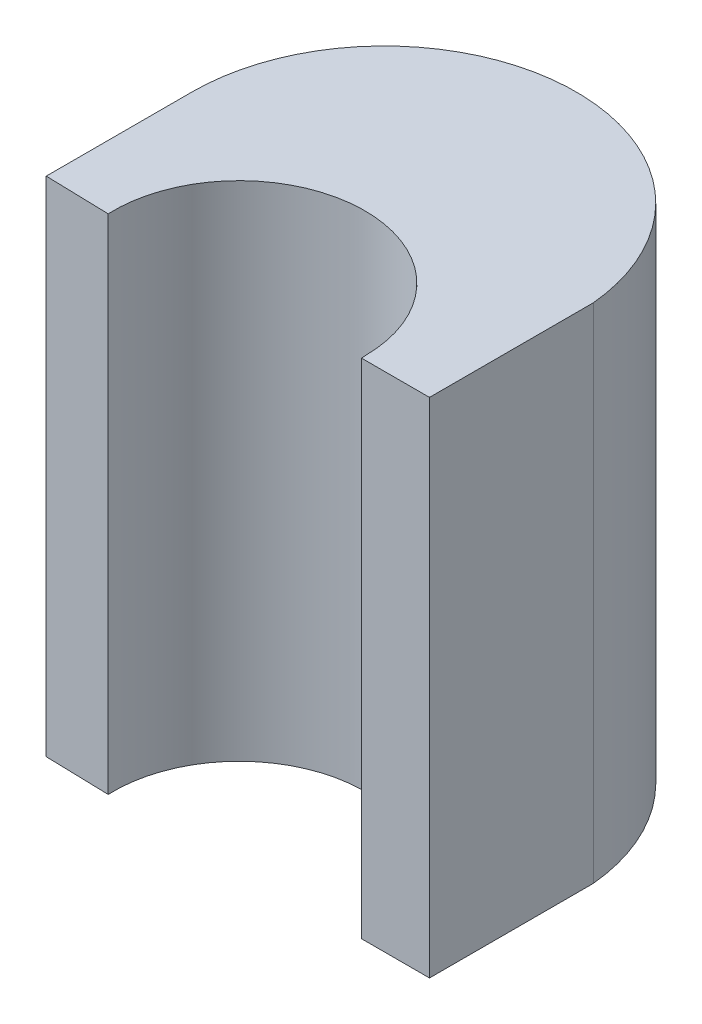
ISO-10303-21;
HEADER;
FILE_DESCRIPTION(('STEP AP214'),'2;1');
FILE_NAME('part.step','',(''),(''),'','','');
FILE_SCHEMA(('AUTOMOTIVE_DESIGN { 1 0 10303 214 1 1 1 1 }'));
ENDSEC;
DATA;
#1=APPLICATION_CONTEXT('core data for automotive mechanical design processes');
#2=APPLICATION_PROTOCOL_DEFINITION('international standard','automotive_design',2000,#1);
#3=PRODUCT_CONTEXT('',#1,'mechanical');
#4=PRODUCT('Part','Part','',(#3));
#5=PRODUCT_RELATED_PRODUCT_CATEGORY('part','',(#4));
#6=PRODUCT_DEFINITION_FORMATION('','',#4);
#7=PRODUCT_DEFINITION_CONTEXT('part definition',#1,'design');
#8=PRODUCT_DEFINITION('design','',#6,#7);
#9=PRODUCT_DEFINITION_SHAPE('','',#8);
#10=(LENGTH_UNIT() NAMED_UNIT(*) SI_UNIT(.MILLI.,.METRE.));
#11=(NAMED_UNIT(*) PLANE_ANGLE_UNIT() SI_UNIT($,.RADIAN.));
#12=(NAMED_UNIT(*) SI_UNIT($,.STERADIAN.) SOLID_ANGLE_UNIT());
#13=UNCERTAINTY_MEASURE_WITH_UNIT(LENGTH_MEASURE(1.E-05),#10,'distance_accuracy_value','');
#14=(GEOMETRIC_REPRESENTATION_CONTEXT(3) GLOBAL_UNCERTAINTY_ASSIGNED_CONTEXT((#13)) GLOBAL_UNIT_ASSIGNED_CONTEXT((#10,
#11,#12)) REPRESENTATION_CONTEXT('',''));
#15=CARTESIAN_POINT('',(0.,0.,0.));
#16=DIRECTION('',(0.,0.,1.));
#17=DIRECTION('',(1.,0.,0.));
#18=AXIS2_PLACEMENT_3D('',#15,#16,#17);
#19=CARTESIAN_POINT('',(1.26536763995208,2.87183105039429,15.5890947887312));
#20=DIRECTION('',(0.,1.,0.));
#21=DIRECTION('',(0.,0.,-1.));
#22=AXIS2_PLACEMENT_3D('',#19,#20,#21);
#23=PLANE('',#22);
#24=CARTESIAN_POINT('',(-2.63265771786195,2.87183105039429,24.489760866987));
#25=DIRECTION('',(0.,1.,0.));
#26=DIRECTION('',(0.,0.,-1.));
#27=AXIS2_PLACEMENT_3D('',#24,#25,#26);
#28=CIRCLE('',#27,0.299999999999994);
#29=CARTESIAN_POINT('',(-2.33292665507399,2.87183105039429,24.4770608669871));
#30=VERTEX_POINT('',#29);
#31=CARTESIAN_POINT('',(-2.33353671329765,2.87183105039429,24.4668125635979));
#32=VERTEX_POINT('',#31);
#33=EDGE_CURVE('E73',#30,#32,#28,.T.);
#34=ORIENTED_EDGE('',*,*,#33,.F.);
#35=DIRECTION('',(1.,0.,2.19014998791785E-13));
#36=VECTOR('',#35,1.);
#37=CARTESIAN_POINT('',(-2.33292665507398,2.87183105039429,24.4770608669871));
#38=LINE('',#37,#36);
#39=CARTESIAN_POINT('',(-2.17054877174569,2.87183105039429,24.4770608669871));
#40=VERTEX_POINT('',#39);
#41=EDGE_CURVE('E101',#30,#40,#38,.T.);
#42=ORIENTED_EDGE('',*,*,#41,.T.);
#43=DIRECTION('',(-2.31603663807447E-12,0.,1.));
#44=VECTOR('',#43,1.);
#45=CARTESIAN_POINT('',(-2.17054877174478,2.87183105039429,24.0858628882505));
#46=LINE('',#45,#44);
#47=CARTESIAN_POINT('',(-2.17054877174478,2.87183105039429,24.0858628882505));
#48=VERTEX_POINT('',#47);
#49=EDGE_CURVE('E27',#48,#40,#46,.T.);
#50=ORIENTED_EDGE('',*,*,#49,.F.);
#51=CARTESIAN_POINT('',(-2.62684216672861,2.87183105039429,24.1289507885883));
#52=DIRECTION('',(0.,1.,0.));
#53=DIRECTION('',(0.995571061700838,0.,-0.0940120263788917));
#54=AXIS2_PLACEMENT_3D('',#51,#52,#53);
#55=CIRCLE('',#54,0.458323280514298);
#56=CARTESIAN_POINT('',(-3.0851654472429,2.87183105039429,24.1289507885881));
#57=VERTEX_POINT('',#56);
#58=EDGE_CURVE('E11',#48,#57,#55,.T.);
#59=ORIENTED_EDGE('',*,*,#58,.T.);
#60=DIRECTION('',(-7.39892430869169E-12,0.,-1.));
#61=VECTOR('',#60,1.);
#62=CARTESIAN_POINT('',(-3.08516544724032,2.87183105039429,24.4770608669869));
#63=LINE('',#62,#61);
#64=CARTESIAN_POINT('',(-3.08516544724032,2.87183105039429,24.4770608669869));
#65=VERTEX_POINT('',#64);
#66=EDGE_CURVE('E132',#65,#57,#63,.T.);
#67=ORIENTED_EDGE('',*,*,#66,.F.);
#68=DIRECTION('',(0.999641624888658,0.,0.0267697924901118));
#69=VECTOR('',#68,1.);
#70=CARTESIAN_POINT('',(-3.08516544724032,2.87183105039429,24.4770608669869));
#71=LINE('',#70,#69);
#72=CARTESIAN_POINT('',(-2.93326342274814,2.87183105039429,24.4811287104753));
#73=VERTEX_POINT('',#72);
#74=EDGE_CURVE('E131',#65,#73,#71,.T.);
#75=ORIENTED_EDGE('',*,*,#74,.T.);
#76=CARTESIAN_POINT('',(-2.63353236004813,2.87183105039429,24.4684287104753));
#77=DIRECTION('',(0.,1.,0.));
#78=DIRECTION('',(0.999103542626609,0.,0.0423333333315546));
#79=AXIS2_PLACEMENT_3D('',#76,#77,#78);
#80=CIRCLE('',#79,0.299999999999991);
#81=EDGE_CURVE('E61',#32,#73,#80,.T.);
#82=ORIENTED_EDGE('',*,*,#81,.F.);
#83=EDGE_LOOP('',(#34,#42,#50,#59,#67,#75,#82));
#84=FACE_BOUND('',#83,.T.);
#85=ADVANCED_FACE('F17',(#84),#23,.T.);
#86=CARTESIAN_POINT('',(-2.62684216672861,2.87183105039429,24.1289507885883));
#87=DIRECTION('',(0.,-1.,0.));
#88=DIRECTION('',(0.995571061700838,0.,-0.0940120263788917));
#89=AXIS2_PLACEMENT_3D('',#86,#87,#88);
#90=CYLINDRICAL_SURFACE('',#89,0.458323280514298);
#91=CARTESIAN_POINT('',(-2.62684216672861,1.6718310055699,24.1289507885883));
#92=DIRECTION('',(0.,1.,0.));
#93=DIRECTION('',(0.995571061700838,0.,-0.0940120263788917));
#94=AXIS2_PLACEMENT_3D('',#91,#92,#93);
#95=CIRCLE('',#94,0.458323280514298);
#96=CARTESIAN_POINT('',(-2.17054877174478,1.6718310055699,24.0858628882505));
#97=VERTEX_POINT('',#96);
#98=CARTESIAN_POINT('',(-3.08516544724289,1.6718310055699,24.1289507885881));
#99=VERTEX_POINT('',#98);
#100=EDGE_CURVE('E117',#97,#99,#95,.T.);
#101=ORIENTED_EDGE('',*,*,#100,.T.);
#102=DIRECTION('',(0.,-1.,0.));
#103=VECTOR('',#102,1.);
#104=CARTESIAN_POINT('',(-3.0851654472429,2.87183105039429,24.1289507885881));
#105=LINE('',#104,#103);
#106=EDGE_CURVE('E136',#57,#99,#105,.T.);
#107=ORIENTED_EDGE('',*,*,#106,.F.);
#108=ORIENTED_EDGE('',*,*,#58,.F.);
#109=DIRECTION('',(0.,-1.,0.));
#110=VECTOR('',#109,1.);
#111=CARTESIAN_POINT('',(-2.17054877174478,2.87183105039429,24.0858628882505));
#112=LINE('',#111,#110);
#113=EDGE_CURVE('E87',#48,#97,#112,.T.);
#114=ORIENTED_EDGE('',*,*,#113,.T.);
#115=EDGE_LOOP('',(#101,#107,#108,#114));
#116=FACE_BOUND('',#115,.T.);
#117=ADVANCED_FACE('F255',(#116),#90,.T.);
#118=CARTESIAN_POINT('',(-2.17054877174478,2.87183105039429,24.0858628882505));
#119=DIRECTION('',(1.,0.,2.31603663807447E-12));
#120=DIRECTION('',(-2.31603663807447E-12,0.,1.));
#121=AXIS2_PLACEMENT_3D('',#118,#119,#120);
#122=PLANE('',#121);
#123=DIRECTION('',(2.31603663807447E-12,0.,-1.));
#124=VECTOR('',#123,1.);
#125=CARTESIAN_POINT('',(-2.17054877173494,1.6718310055699,19.8374788384868));
#126=LINE('',#125,#124);
#127=CARTESIAN_POINT('',(-2.17054877174568,1.6718310055699,24.4770608669871));
#128=VERTEX_POINT('',#127);
#129=EDGE_CURVE('E96',#128,#97,#126,.T.);
#130=ORIENTED_EDGE('',*,*,#129,.T.);
#131=ORIENTED_EDGE('',*,*,#113,.F.);
#132=ORIENTED_EDGE('',*,*,#49,.T.);
#133=DIRECTION('',(0.,-1.,0.));
#134=VECTOR('',#133,1.);
#135=CARTESIAN_POINT('',(-2.17054877174569,2.87183105039429,24.4770608669871));
#136=LINE('',#135,#134);
#137=EDGE_CURVE('E93',#40,#128,#136,.T.);
#138=ORIENTED_EDGE('',*,*,#137,.T.);
#139=EDGE_LOOP('',(#130,#131,#132,#138));
#140=FACE_BOUND('',#139,.T.);
#141=ADVANCED_FACE('F19',(#140),#122,.T.);
#142=CARTESIAN_POINT('',(-2.17054877174569,2.87183105039429,24.4770608669871));
#143=DIRECTION('',(-2.19014998791785E-13,0.,1.));
#144=DIRECTION('',(1.,0.,2.19014998791785E-13));
#145=AXIS2_PLACEMENT_3D('',#142,#143,#144);
#146=PLANE('',#145);
#147=DIRECTION('',(1.,0.,2.19014998791785E-13));
#148=VECTOR('',#147,1.);
#149=CARTESIAN_POINT('',(-0.452590565897774,1.6718310055699,24.4770608669875));
#150=LINE('',#149,#148);
#151=CARTESIAN_POINT('',(-2.33292665507399,1.6718310055699,24.4770608669871));
#152=VERTEX_POINT('',#151);
#153=EDGE_CURVE('E105',#152,#128,#150,.T.);
#154=ORIENTED_EDGE('',*,*,#153,.T.);
#155=ORIENTED_EDGE('',*,*,#137,.F.);
#156=ORIENTED_EDGE('',*,*,#41,.F.);
#157=DIRECTION('',(0.,-1.,0.));
#158=VECTOR('',#157,1.);
#159=CARTESIAN_POINT('',(-2.33292665507399,2.87183105039429,24.4770608669871));
#160=LINE('',#159,#158);
#161=EDGE_CURVE('E108',#30,#152,#160,.T.);
#162=ORIENTED_EDGE('',*,*,#161,.T.);
#163=EDGE_LOOP('',(#154,#155,#156,#162));
#164=FACE_BOUND('',#163,.T.);
#165=ADVANCED_FACE('F106',(#164),#146,.T.);
#166=CARTESIAN_POINT('',(-2.63265771786195,2.87183105039429,24.489760866987));
#167=DIRECTION('',(0.,-1.,0.));
#168=DIRECTION('',(0.,0.,-1.));
#169=AXIS2_PLACEMENT_3D('',#166,#167,#168);
#170=CYLINDRICAL_SURFACE('',#169,0.299999999999994);
#171=CARTESIAN_POINT('',(-2.63265771786195,1.6718310055699,24.489760866987));
#172=DIRECTION('',(0.,-1.,0.));
#173=DIRECTION('',(0.,0.,-1.));
#174=AXIS2_PLACEMENT_3D('',#171,#172,#173);
#175=CIRCLE('',#174,0.299999999999994);
#176=CARTESIAN_POINT('',(-2.33353671329764,1.6718310055699,24.4668125635979));
#177=VERTEX_POINT('',#176);
#178=EDGE_CURVE('E227',#177,#152,#175,.T.);
#179=ORIENTED_EDGE('',*,*,#178,.T.);
#180=ORIENTED_EDGE('',*,*,#161,.F.);
#181=ORIENTED_EDGE('',*,*,#33,.T.);
#182=DIRECTION('',(0.,-1.,0.));
#183=VECTOR('',#182,1.);
#184=CARTESIAN_POINT('',(-2.33353671329765,2.87183105039429,24.4668125635979));
#185=LINE('',#184,#183);
#186=EDGE_CURVE('E128',#32,#177,#185,.T.);
#187=ORIENTED_EDGE('',*,*,#186,.T.);
#188=EDGE_LOOP('',(#179,#180,#181,#187));
#189=FACE_BOUND('',#188,.T.);
#190=ADVANCED_FACE('F234',(#189),#170,.F.);
#191=CARTESIAN_POINT('',(-2.63353236004813,2.87183105039429,24.4684287104753));
#192=DIRECTION('',(0.,-1.,0.));
#193=DIRECTION('',(-0.0238643193791569,0.,-0.999715206576638));
#194=AXIS2_PLACEMENT_3D('',#191,#192,#193);
#195=CYLINDRICAL_SURFACE('',#194,0.299999999999991);
#196=CARTESIAN_POINT('',(-2.63353236004813,1.6718310055699,24.4684287104753));
#197=DIRECTION('',(0.,-1.,0.));
#198=DIRECTION('',(0.999103542626609,0.,0.0423333333315546));
#199=AXIS2_PLACEMENT_3D('',#196,#197,#198);
#200=CIRCLE('',#199,0.299999999999991);
#201=CARTESIAN_POINT('',(-2.93326342274813,1.6718310055699,24.4811287104753));
#202=VERTEX_POINT('',#201);
#203=EDGE_CURVE('E221',#202,#177,#200,.T.);
#204=ORIENTED_EDGE('',*,*,#203,.T.);
#205=ORIENTED_EDGE('',*,*,#186,.F.);
#206=ORIENTED_EDGE('',*,*,#81,.T.);
#207=DIRECTION('',(0.,-1.,0.));
#208=VECTOR('',#207,1.);
#209=CARTESIAN_POINT('',(-2.93326342274814,2.87183105039429,24.4811287104753));
#210=LINE('',#209,#208);
#211=EDGE_CURVE('E139',#73,#202,#210,.T.);
#212=ORIENTED_EDGE('',*,*,#211,.T.);
#213=EDGE_LOOP('',(#204,#205,#206,#212));
#214=FACE_BOUND('',#213,.T.);
#215=ADVANCED_FACE('F267',(#214),#195,.F.);
#216=CARTESIAN_POINT('',(-2.93326342274814,2.87183105039429,24.4811287104753));
#217=DIRECTION('',(-0.0267697924901118,0.,0.999641624888658));
#218=DIRECTION('',(0.,1.,0.));
#219=AXIS2_PLACEMENT_3D('',#216,#217,#218);
#220=PLANE('',#219);
#221=DIRECTION('',(0.999641624888658,0.,0.0267697924901118));
#222=VECTOR('',#221,1.);
#223=CARTESIAN_POINT('',(-0.954428604671884,1.6718310055699,24.5341206989372));
#224=LINE('',#223,#222);
#225=CARTESIAN_POINT('',(-3.08516544724032,1.6718310055699,24.4770608669869));
#226=VERTEX_POINT('',#225);
#227=EDGE_CURVE('E213',#226,#202,#224,.T.);
#228=ORIENTED_EDGE('',*,*,#227,.T.);
#229=ORIENTED_EDGE('',*,*,#211,.F.);
#230=ORIENTED_EDGE('',*,*,#74,.F.);
#231=DIRECTION('',(0.,-1.,0.));
#232=VECTOR('',#231,1.);
#233=CARTESIAN_POINT('',(-3.08516544724032,2.87183105039429,24.4770608669869));
#234=LINE('',#233,#232);
#235=EDGE_CURVE('E113',#65,#226,#234,.T.);
#236=ORIENTED_EDGE('',*,*,#235,.T.);
#237=EDGE_LOOP('',(#228,#229,#230,#236));
#238=FACE_BOUND('',#237,.T.);
#239=ADVANCED_FACE('F251',(#238),#220,.T.);
#240=CARTESIAN_POINT('',(-3.08516544724032,2.87183105039429,24.4770608669869));
#241=DIRECTION('',(-1.,0.,7.39892430869169E-12));
#242=DIRECTION('',(0.,1.,0.));
#243=AXIS2_PLACEMENT_3D('',#240,#241,#242);
#244=PLANE('',#243);
#245=DIRECTION('',(7.39892430869169E-12,0.,1.));
#246=VECTOR('',#245,1.);
#247=CARTESIAN_POINT('',(-3.08516544727321,1.6718310055699,20.0330778278751));
#248=LINE('',#247,#246);
#249=EDGE_CURVE('E124',#99,#226,#248,.T.);
#250=ORIENTED_EDGE('',*,*,#249,.T.);
#251=ORIENTED_EDGE('',*,*,#235,.F.);
#252=ORIENTED_EDGE('',*,*,#66,.T.);
#253=ORIENTED_EDGE('',*,*,#106,.T.);
#254=EDGE_LOOP('',(#250,#251,#252,#253));
#255=FACE_BOUND('',#254,.T.);
#256=ADVANCED_FACE('F254',(#255),#244,.T.);
#257=CARTESIAN_POINT('',(1.26536763995209,1.6718310055699,15.5890947887312));
#258=DIRECTION('',(0.,1.,0.));
#259=DIRECTION('',(0.,0.,-1.));
#260=AXIS2_PLACEMENT_3D('',#257,#258,#259);
#261=PLANE('',#260);
#262=ORIENTED_EDGE('',*,*,#178,.F.);
#263=ORIENTED_EDGE('',*,*,#203,.F.);
#264=ORIENTED_EDGE('',*,*,#227,.F.);
#265=ORIENTED_EDGE('',*,*,#249,.F.);
#266=ORIENTED_EDGE('',*,*,#100,.F.);
#267=ORIENTED_EDGE('',*,*,#129,.F.);
#268=ORIENTED_EDGE('',*,*,#153,.F.);
#269=EDGE_LOOP('',(#262,#263,#264,#265,#266,#267,#268));
#270=FACE_BOUND('',#269,.T.);
#271=ADVANCED_FACE('F115',(#270),#261,.F.);
#272=CLOSED_SHELL('',(#85,#117,#141,#165,#190,#215,#239,#256,#271));
#273=MANIFOLD_SOLID_BREP('B1',#272);
#274=ADVANCED_BREP_SHAPE_REPRESENTATION('',(#18,#273),#14);
#275=SHAPE_DEFINITION_REPRESENTATION(#9,#274);
ENDSEC;
END-ISO-10303-21;
